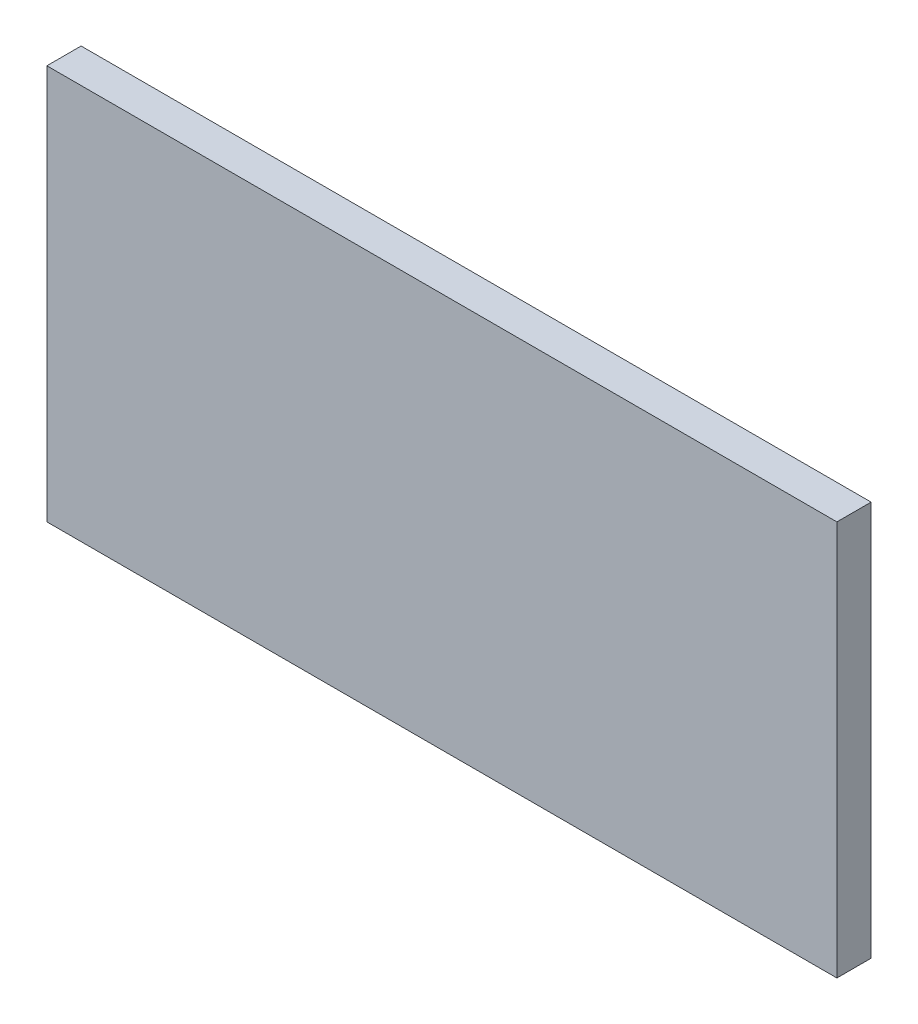
ISO-10303-21;
HEADER;
FILE_DESCRIPTION(('STEP AP214'),'2;1');
FILE_NAME('part.step','',(''),(''),'','','');
FILE_SCHEMA(('AUTOMOTIVE_DESIGN { 1 0 10303 214 1 1 1 1 }'));
ENDSEC;
DATA;
#1=APPLICATION_CONTEXT('core data for automotive mechanical design processes');
#2=APPLICATION_PROTOCOL_DEFINITION('international standard','automotive_design',2000,#1);
#3=PRODUCT_CONTEXT('',#1,'mechanical');
#4=PRODUCT('Part','Part','',(#3));
#5=PRODUCT_RELATED_PRODUCT_CATEGORY('part','',(#4));
#6=PRODUCT_DEFINITION_FORMATION('','',#4);
#7=PRODUCT_DEFINITION_CONTEXT('part definition',#1,'design');
#8=PRODUCT_DEFINITION('design','',#6,#7);
#9=PRODUCT_DEFINITION_SHAPE('','',#8);
#10=(LENGTH_UNIT() NAMED_UNIT(*) SI_UNIT(.MILLI.,.METRE.));
#11=(NAMED_UNIT(*) PLANE_ANGLE_UNIT() SI_UNIT($,.RADIAN.));
#12=(NAMED_UNIT(*) SI_UNIT($,.STERADIAN.) SOLID_ANGLE_UNIT());
#13=UNCERTAINTY_MEASURE_WITH_UNIT(LENGTH_MEASURE(1.E-05),#10,'distance_accuracy_value','');
#14=(GEOMETRIC_REPRESENTATION_CONTEXT(3) GLOBAL_UNCERTAINTY_ASSIGNED_CONTEXT((#13)) GLOBAL_UNIT_ASSIGNED_CONTEXT((#10,
#11,#12)) REPRESENTATION_CONTEXT('',''));
#15=CARTESIAN_POINT('',(0.,0.,0.));
#16=DIRECTION('',(0.,0.,1.));
#17=DIRECTION('',(1.,0.,0.));
#18=AXIS2_PLACEMENT_3D('',#15,#16,#17);
#19=CARTESIAN_POINT('',(-38.1,-19.05,3.302));
#20=DIRECTION('',(1.,0.,0.));
#21=DIRECTION('',(0.,0.,-1.));
#22=AXIS2_PLACEMENT_3D('',#19,#20,#21);
#23=PLANE('',#22);
#24=DIRECTION('',(0.,-1.,0.));
#25=VECTOR('',#24,1.);
#26=CARTESIAN_POINT('',(-38.1,-19.05,0.));
#27=LINE('',#26,#25);
#28=CARTESIAN_POINT('',(-38.1,19.05,0.));
#29=VERTEX_POINT('',#28);
#30=CARTESIAN_POINT('',(-38.1,-19.05,0.));
#31=VERTEX_POINT('',#30);
#32=EDGE_CURVE('E96',#29,#31,#27,.T.);
#33=ORIENTED_EDGE('',*,*,#32,.T.);
#34=DIRECTION('',(0.,0.,-1.));
#35=VECTOR('',#34,1.);
#36=CARTESIAN_POINT('',(-38.1,-19.05,3.302));
#37=LINE('',#36,#35);
#38=CARTESIAN_POINT('',(-38.1,-19.05,3.302));
#39=VERTEX_POINT('',#38);
#40=EDGE_CURVE('E11',#39,#31,#37,.T.);
#41=ORIENTED_EDGE('',*,*,#40,.F.);
#42=DIRECTION('',(0.,-1.,0.));
#43=VECTOR('',#42,1.);
#44=CARTESIAN_POINT('',(-38.1,-19.05,3.302));
#45=LINE('',#44,#43);
#46=CARTESIAN_POINT('',(-38.1,19.05,3.302));
#47=VERTEX_POINT('',#46);
#48=EDGE_CURVE('E84',#47,#39,#45,.T.);
#49=ORIENTED_EDGE('',*,*,#48,.F.);
#50=DIRECTION('',(0.,0.,-1.));
#51=VECTOR('',#50,1.);
#52=CARTESIAN_POINT('',(-38.1,19.05,3.302));
#53=LINE('',#52,#51);
#54=EDGE_CURVE('E92',#47,#29,#53,.T.);
#55=ORIENTED_EDGE('',*,*,#54,.T.);
#56=EDGE_LOOP('',(#33,#41,#49,#55));
#57=FACE_BOUND('',#56,.T.);
#58=ADVANCED_FACE('F33',(#57),#23,.F.);
#59=CARTESIAN_POINT('',(38.1,-19.05,3.302));
#60=DIRECTION('',(0.,1.,0.));
#61=DIRECTION('',(0.,0.,1.));
#62=AXIS2_PLACEMENT_3D('',#59,#60,#61);
#63=PLANE('',#62);
#64=DIRECTION('',(1.,0.,0.));
#65=VECTOR('',#64,1.);
#66=CARTESIAN_POINT('',(38.1,-19.05,0.));
#67=LINE('',#66,#65);
#68=CARTESIAN_POINT('',(38.1,-19.05,0.));
#69=VERTEX_POINT('',#68);
#70=EDGE_CURVE('E88',#31,#69,#67,.T.);
#71=ORIENTED_EDGE('',*,*,#70,.T.);
#72=DIRECTION('',(0.,0.,-1.));
#73=VECTOR('',#72,1.);
#74=CARTESIAN_POINT('',(38.1,-19.05,3.302));
#75=LINE('',#74,#73);
#76=CARTESIAN_POINT('',(38.1,-19.05,3.302));
#77=VERTEX_POINT('',#76);
#78=EDGE_CURVE('E41',#77,#69,#75,.T.);
#79=ORIENTED_EDGE('',*,*,#78,.F.);
#80=DIRECTION('',(1.,0.,0.));
#81=VECTOR('',#80,1.);
#82=CARTESIAN_POINT('',(38.1,-19.05,3.302));
#83=LINE('',#82,#81);
#84=EDGE_CURVE('E79',#39,#77,#83,.T.);
#85=ORIENTED_EDGE('',*,*,#84,.F.);
#86=ORIENTED_EDGE('',*,*,#40,.T.);
#87=EDGE_LOOP('',(#71,#79,#85,#86));
#88=FACE_BOUND('',#87,.T.);
#89=ADVANCED_FACE('F87',(#88),#63,.F.);
#90=CARTESIAN_POINT('',(38.1,-19.05,3.302));
#91=DIRECTION('',(-1.,0.,0.));
#92=DIRECTION('',(0.,0.,1.));
#93=AXIS2_PLACEMENT_3D('',#90,#91,#92);
#94=PLANE('',#93);
#95=DIRECTION('',(0.,1.,0.));
#96=VECTOR('',#95,1.);
#97=CARTESIAN_POINT('',(38.1,-19.05,0.));
#98=LINE('',#97,#96);
#99=CARTESIAN_POINT('',(38.1,19.05,0.));
#100=VERTEX_POINT('',#99);
#101=EDGE_CURVE('E66',#69,#100,#98,.T.);
#102=ORIENTED_EDGE('',*,*,#101,.T.);
#103=DIRECTION('',(0.,0.,-1.));
#104=VECTOR('',#103,1.);
#105=CARTESIAN_POINT('',(38.1,19.05,3.302));
#106=LINE('',#105,#104);
#107=CARTESIAN_POINT('',(38.1,19.05,3.302));
#108=VERTEX_POINT('',#107);
#109=EDGE_CURVE('E89',#108,#100,#106,.T.);
#110=ORIENTED_EDGE('',*,*,#109,.F.);
#111=DIRECTION('',(0.,1.,0.));
#112=VECTOR('',#111,1.);
#113=CARTESIAN_POINT('',(38.1,-19.05,3.302));
#114=LINE('',#113,#112);
#115=EDGE_CURVE('E82',#77,#108,#114,.T.);
#116=ORIENTED_EDGE('',*,*,#115,.F.);
#117=ORIENTED_EDGE('',*,*,#78,.T.);
#118=EDGE_LOOP('',(#102,#110,#116,#117));
#119=FACE_BOUND('',#118,.T.);
#120=ADVANCED_FACE('F90',(#119),#94,.F.);
#121=CARTESIAN_POINT('',(38.1,19.05,3.302));
#122=DIRECTION('',(0.,-1.,0.));
#123=DIRECTION('',(0.,0.,-1.));
#124=AXIS2_PLACEMENT_3D('',#121,#122,#123);
#125=PLANE('',#124);
#126=DIRECTION('',(-1.,0.,0.));
#127=VECTOR('',#126,1.);
#128=CARTESIAN_POINT('',(38.1,19.05,0.));
#129=LINE('',#128,#127);
#130=EDGE_CURVE('E72',#100,#29,#129,.T.);
#131=ORIENTED_EDGE('',*,*,#130,.T.);
#132=ORIENTED_EDGE('',*,*,#54,.F.);
#133=DIRECTION('',(-1.,0.,0.));
#134=VECTOR('',#133,1.);
#135=CARTESIAN_POINT('',(38.1,19.05,3.302));
#136=LINE('',#135,#134);
#137=EDGE_CURVE('E49',#108,#47,#136,.T.);
#138=ORIENTED_EDGE('',*,*,#137,.F.);
#139=ORIENTED_EDGE('',*,*,#109,.T.);
#140=EDGE_LOOP('',(#131,#132,#138,#139));
#141=FACE_BOUND('',#140,.T.);
#142=ADVANCED_FACE('F103',(#141),#125,.F.);
#143=CARTESIAN_POINT('',(0.,0.,3.302));
#144=DIRECTION('',(0.,0.,1.));
#145=DIRECTION('',(1.,0.,0.));
#146=AXIS2_PLACEMENT_3D('',#143,#144,#145);
#147=PLANE('',#146);
#148=ORIENTED_EDGE('',*,*,#48,.T.);
#149=ORIENTED_EDGE('',*,*,#84,.T.);
#150=ORIENTED_EDGE('',*,*,#115,.T.);
#151=ORIENTED_EDGE('',*,*,#137,.T.);
#152=EDGE_LOOP('',(#148,#149,#150,#151));
#153=FACE_BOUND('',#152,.T.);
#154=ADVANCED_FACE('F80',(#153),#147,.T.);
#155=CARTESIAN_POINT('',(0.,0.,0.));
#156=DIRECTION('',(0.,0.,1.));
#157=DIRECTION('',(1.,0.,0.));
#158=AXIS2_PLACEMENT_3D('',#155,#156,#157);
#159=PLANE('',#158);
#160=ORIENTED_EDGE('',*,*,#32,.F.);
#161=ORIENTED_EDGE('',*,*,#130,.F.);
#162=ORIENTED_EDGE('',*,*,#101,.F.);
#163=ORIENTED_EDGE('',*,*,#70,.F.);
#164=EDGE_LOOP('',(#160,#161,#162,#163));
#165=FACE_BOUND('',#164,.T.);
#166=ADVANCED_FACE('F106',(#165),#159,.F.);
#167=CLOSED_SHELL('',(#58,#89,#120,#142,#154,#166));
#168=MANIFOLD_SOLID_BREP('B2',#167);
#169=ADVANCED_BREP_SHAPE_REPRESENTATION('',(#18,#168),#14);
#170=SHAPE_DEFINITION_REPRESENTATION(#9,#169);
ENDSEC;
END-ISO-10303-21;
